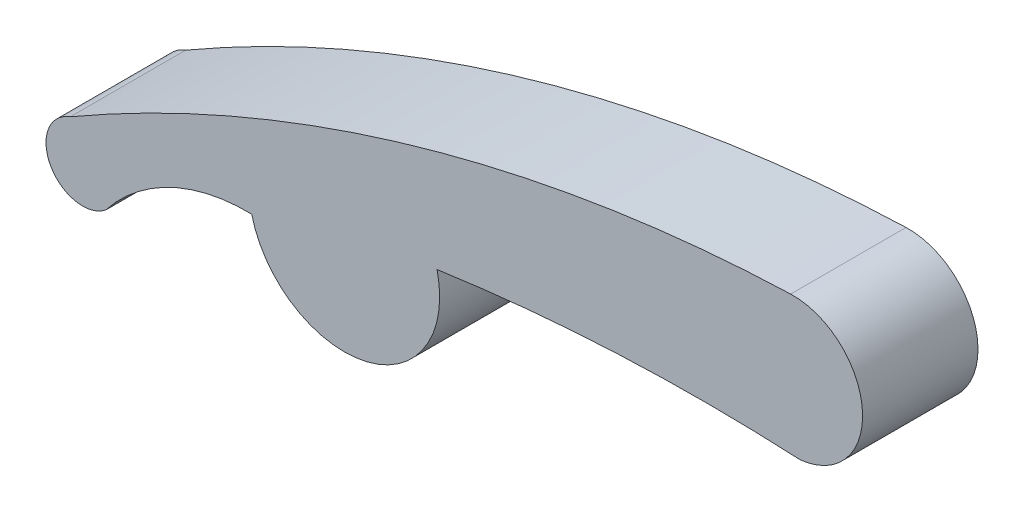
ISO-10303-21;
HEADER;
FILE_DESCRIPTION(('STEP AP214'),'2;1');
FILE_NAME('part.step','',(''),(''),'','','');
FILE_SCHEMA(('AUTOMOTIVE_DESIGN { 1 0 10303 214 1 1 1 1 }'));
ENDSEC;
DATA;
#1=APPLICATION_CONTEXT('core data for automotive mechanical design processes');
#2=APPLICATION_PROTOCOL_DEFINITION('international standard','automotive_design',2000,#1);
#3=PRODUCT_CONTEXT('',#1,'mechanical');
#4=PRODUCT('Part','Part','',(#3));
#5=PRODUCT_RELATED_PRODUCT_CATEGORY('part','',(#4));
#6=PRODUCT_DEFINITION_FORMATION('','',#4);
#7=PRODUCT_DEFINITION_CONTEXT('part definition',#1,'design');
#8=PRODUCT_DEFINITION('design','',#6,#7);
#9=PRODUCT_DEFINITION_SHAPE('','',#8);
#10=(LENGTH_UNIT() NAMED_UNIT(*) SI_UNIT(.MILLI.,.METRE.));
#11=(NAMED_UNIT(*) PLANE_ANGLE_UNIT() SI_UNIT($,.RADIAN.));
#12=(NAMED_UNIT(*) SI_UNIT($,.STERADIAN.) SOLID_ANGLE_UNIT());
#13=UNCERTAINTY_MEASURE_WITH_UNIT(LENGTH_MEASURE(1.E-05),#10,'distance_accuracy_value','');
#14=(GEOMETRIC_REPRESENTATION_CONTEXT(3) GLOBAL_UNCERTAINTY_ASSIGNED_CONTEXT((#13)) GLOBAL_UNIT_ASSIGNED_CONTEXT((#10,
#11,#12)) REPRESENTATION_CONTEXT('',''));
#15=CARTESIAN_POINT('',(0.,0.,0.));
#16=DIRECTION('',(0.,0.,1.));
#17=DIRECTION('',(1.,0.,0.));
#18=AXIS2_PLACEMENT_3D('',#15,#16,#17);
#19=CARTESIAN_POINT('',(0.,0.,30.));
#20=DIRECTION('',(0.,0.,-1.));
#21=DIRECTION('',(-1.,0.,0.));
#22=AXIS2_PLACEMENT_3D('',#19,#20,#21);
#23=CYLINDRICAL_SURFACE('',#22,24.7797364159116);
#24=CARTESIAN_POINT('',(0.,0.,0.));
#25=DIRECTION('',(0.,0.,1.));
#26=DIRECTION('',(1.,0.,0.));
#27=AXIS2_PLACEMENT_3D('',#24,#25,#26);
#28=CIRCLE('',#27,24.7797364159116);
#29=CARTESIAN_POINT('',(-24.087895886264,-5.81451705772353,0.));
#30=VERTEX_POINT('',#29);
#31=CARTESIAN_POINT('',(24.0868229632758,5.81896007701233,0.));
#32=VERTEX_POINT('',#31);
#33=EDGE_CURVE('E125',#30,#32,#28,.T.);
#34=ORIENTED_EDGE('',*,*,#33,.T.);
#35=DIRECTION('',(0.,0.,-1.));
#36=VECTOR('',#35,1.);
#37=CARTESIAN_POINT('',(24.0868229632758,5.81896007701233,30.));
#38=LINE('',#37,#36);
#39=CARTESIAN_POINT('',(24.0868229632758,5.81896007701233,30.));
#40=VERTEX_POINT('',#39);
#41=EDGE_CURVE('E11',#40,#32,#38,.T.);
#42=ORIENTED_EDGE('',*,*,#41,.F.);
#43=CARTESIAN_POINT('',(0.,0.,30.));
#44=DIRECTION('',(0.,0.,1.));
#45=DIRECTION('',(1.,0.,0.));
#46=AXIS2_PLACEMENT_3D('',#43,#44,#45);
#47=CIRCLE('',#46,24.7797364159116);
#48=CARTESIAN_POINT('',(-24.087895886264,-5.81451705772353,30.));
#49=VERTEX_POINT('',#48);
#50=EDGE_CURVE('E135',#49,#40,#47,.T.);
#51=ORIENTED_EDGE('',*,*,#50,.F.);
#52=DIRECTION('',(0.,0.,-1.));
#53=VECTOR('',#52,1.);
#54=CARTESIAN_POINT('',(-24.087895886264,-5.81451705772353,30.));
#55=LINE('',#54,#53);
#56=EDGE_CURVE('E121',#49,#30,#55,.T.);
#57=ORIENTED_EDGE('',*,*,#56,.T.);
#58=EDGE_LOOP('',(#34,#42,#51,#57));
#59=FACE_BOUND('',#58,.T.);
#60=ADVANCED_FACE('F41',(#59),#23,.T.);
#61=CARTESIAN_POINT('',(93.5548495195561,-474.035247811777,30.));
#62=DIRECTION('',(0.,0.,-1.));
#63=DIRECTION('',(-1.,0.,0.));
#64=AXIS2_PLACEMENT_3D('',#61,#62,#63);
#65=CYLINDRICAL_SURFACE('',#64,484.856543260171);
#66=CARTESIAN_POINT('',(93.5548495195561,-474.035247811777,0.));
#67=DIRECTION('',(0.,0.,-1.));
#68=DIRECTION('',(-1.,0.,0.));
#69=AXIS2_PLACEMENT_3D('',#66,#67,#68);
#70=CIRCLE('',#69,484.856543260171);
#71=CARTESIAN_POINT('',(118.482977132816,10.1800514053156,0.));
#72=VERTEX_POINT('',#71);
#73=EDGE_CURVE('E128',#32,#72,#70,.T.);
#74=ORIENTED_EDGE('',*,*,#73,.T.);
#75=DIRECTION('',(0.,0.,-1.));
#76=VECTOR('',#75,1.);
#77=CARTESIAN_POINT('',(118.482977132816,10.1800514053156,30.));
#78=LINE('',#77,#76);
#79=CARTESIAN_POINT('',(118.482977132816,10.1800514053156,30.));
#80=VERTEX_POINT('',#79);
#81=EDGE_CURVE('E49',#80,#72,#78,.T.);
#82=ORIENTED_EDGE('',*,*,#81,.F.);
#83=CARTESIAN_POINT('',(93.5548495195561,-474.035247811777,30.));
#84=DIRECTION('',(0.,0.,-1.));
#85=DIRECTION('',(-1.,0.,0.));
#86=AXIS2_PLACEMENT_3D('',#83,#84,#85);
#87=CIRCLE('',#86,484.856543260171);
#88=EDGE_CURVE('E94',#40,#80,#87,.T.);
#89=ORIENTED_EDGE('',*,*,#88,.F.);
#90=ORIENTED_EDGE('',*,*,#41,.T.);
#91=EDGE_LOOP('',(#74,#82,#89,#90));
#92=FACE_BOUND('',#91,.T.);
#93=ADVANCED_FACE('F159',(#92),#65,.F.);
#94=CARTESIAN_POINT('',(116.644451219308,28.1792831659425,30.));
#95=DIRECTION('',(0.,0.,-1.));
#96=DIRECTION('',(-1.,0.,0.));
#97=AXIS2_PLACEMENT_3D('',#94,#95,#96);
#98=CYLINDRICAL_SURFACE('',#97,18.0928859363949);
#99=CARTESIAN_POINT('',(116.644451219308,28.1792831659425,0.));
#100=DIRECTION('',(0.,0.,1.));
#101=DIRECTION('',(-1.,0.,0.));
#102=AXIS2_PLACEMENT_3D('',#99,#100,#101);
#103=CIRCLE('',#102,18.0928859363949);
#104=CARTESIAN_POINT('',(116.030457788729,46.2617479751051,0.));
#105=VERTEX_POINT('',#104);
#106=EDGE_CURVE('E130',#72,#105,#103,.T.);
#107=ORIENTED_EDGE('',*,*,#106,.T.);
#108=DIRECTION('',(0.,0.,-1.));
#109=VECTOR('',#108,1.);
#110=CARTESIAN_POINT('',(116.030457788729,46.2617479751051,30.));
#111=LINE('',#110,#109);
#112=CARTESIAN_POINT('',(116.030457788729,46.2617479751051,30.));
#113=VERTEX_POINT('',#112);
#114=EDGE_CURVE('E116',#113,#105,#111,.T.);
#115=ORIENTED_EDGE('',*,*,#114,.F.);
#116=CARTESIAN_POINT('',(116.644451219308,28.1792831659425,30.));
#117=DIRECTION('',(0.,0.,1.));
#118=DIRECTION('',(-1.,0.,0.));
#119=AXIS2_PLACEMENT_3D('',#116,#117,#118);
#120=CIRCLE('',#119,18.0928859363949);
#121=EDGE_CURVE('E107',#80,#113,#120,.T.);
#122=ORIENTED_EDGE('',*,*,#121,.F.);
#123=ORIENTED_EDGE('',*,*,#81,.T.);
#124=EDGE_LOOP('',(#107,#115,#122,#123));
#125=FACE_BOUND('',#124,.T.);
#126=ADVANCED_FACE('F141',(#125),#98,.T.);
#127=CARTESIAN_POINT('',(129.639658120415,-354.537143058833,30.));
#128=DIRECTION('',(0.,0.,-1.));
#129=DIRECTION('',(-1.,0.,0.));
#130=AXIS2_PLACEMENT_3D('',#127,#128,#129);
#131=CYLINDRICAL_SURFACE('',#130,401.029875929092);
#132=CARTESIAN_POINT('',(129.639658120415,-354.537143058833,0.));
#133=DIRECTION('',(0.,0.,1.));
#134=DIRECTION('',(-1.,0.,0.));
#135=AXIS2_PLACEMENT_3D('',#132,#133,#134);
#136=CIRCLE('',#135,401.029875929092);
#137=CARTESIAN_POINT('',(-71.2994286744356,-7.48031084578749,0.));
#138=VERTEX_POINT('',#137);
#139=EDGE_CURVE('E115',#105,#138,#136,.T.);
#140=ORIENTED_EDGE('',*,*,#139,.T.);
#141=DIRECTION('',(0.,0.,-1.));
#142=VECTOR('',#141,1.);
#143=CARTESIAN_POINT('',(-71.2994286744356,-7.48031084578749,30.));
#144=LINE('',#143,#142);
#145=CARTESIAN_POINT('',(-71.2994286744356,-7.48031084578749,30.));
#146=VERTEX_POINT('',#145);
#147=EDGE_CURVE('E112',#146,#138,#144,.T.);
#148=ORIENTED_EDGE('',*,*,#147,.F.);
#149=CARTESIAN_POINT('',(129.639658120415,-354.537143058833,30.));
#150=DIRECTION('',(0.,0.,1.));
#151=DIRECTION('',(-1.,0.,0.));
#152=AXIS2_PLACEMENT_3D('',#149,#150,#151);
#153=CIRCLE('',#152,401.029875929092);
#154=EDGE_CURVE('E101',#113,#146,#153,.T.);
#155=ORIENTED_EDGE('',*,*,#154,.F.);
#156=ORIENTED_EDGE('',*,*,#114,.T.);
#157=EDGE_LOOP('',(#140,#148,#155,#156));
#158=FACE_BOUND('',#157,.T.);
#159=ADVANCED_FACE('F113',(#158),#131,.T.);
#160=CARTESIAN_POINT('',(-68.0425965445967,-16.4379151801327,30.));
#161=DIRECTION('',(0.,0.,-1.));
#162=DIRECTION('',(-1.,0.,0.));
#163=AXIS2_PLACEMENT_3D('',#160,#161,#162);
#164=CYLINDRICAL_SURFACE('',#163,9.53129744224947);
#165=CARTESIAN_POINT('',(-68.0425965445967,-16.4379151801327,0.));
#166=DIRECTION('',(0.,0.,1.));
#167=DIRECTION('',(1.,0.,0.));
#168=AXIS2_PLACEMENT_3D('',#165,#166,#167);
#169=CIRCLE('',#168,9.53129744224947);
#170=CARTESIAN_POINT('',(-61.9924777839588,-23.8028112360733,0.));
#171=VERTEX_POINT('',#170);
#172=EDGE_CURVE('E80',#138,#171,#169,.T.);
#173=ORIENTED_EDGE('',*,*,#172,.T.);
#174=DIRECTION('',(0.,0.,-1.));
#175=VECTOR('',#174,1.);
#176=CARTESIAN_POINT('',(-61.9924777839588,-23.8028112360733,30.));
#177=LINE('',#176,#175);
#178=CARTESIAN_POINT('',(-61.9924777839588,-23.8028112360733,30.));
#179=VERTEX_POINT('',#178);
#180=EDGE_CURVE('E117',#179,#171,#177,.T.);
#181=ORIENTED_EDGE('',*,*,#180,.F.);
#182=CARTESIAN_POINT('',(-68.0425965445967,-16.4379151801327,30.));
#183=DIRECTION('',(0.,0.,1.));
#184=DIRECTION('',(1.,0.,0.));
#185=AXIS2_PLACEMENT_3D('',#182,#183,#184);
#186=CIRCLE('',#185,9.53129744224947);
#187=EDGE_CURVE('E105',#146,#179,#186,.T.);
#188=ORIENTED_EDGE('',*,*,#187,.F.);
#189=ORIENTED_EDGE('',*,*,#147,.T.);
#190=EDGE_LOOP('',(#173,#181,#188,#189));
#191=FACE_BOUND('',#190,.T.);
#192=ADVANCED_FACE('F119',(#191),#164,.T.);
#193=CARTESIAN_POINT('',(-25.1623080904096,-52.4805808009641,30.));
#194=DIRECTION('',(0.,0.,-1.));
#195=DIRECTION('',(-1.,0.,0.));
#196=AXIS2_PLACEMENT_3D('',#193,#194,#195);
#197=CYLINDRICAL_SURFACE('',#196,46.6784304242614);
#198=CARTESIAN_POINT('',(-25.1623080904096,-52.4805808009641,0.));
#199=DIRECTION('',(0.,0.,-1.));
#200=DIRECTION('',(-1.,0.,0.));
#201=AXIS2_PLACEMENT_3D('',#198,#199,#200);
#202=CIRCLE('',#201,46.6784304242614);
#203=EDGE_CURVE('E86',#171,#30,#202,.T.);
#204=ORIENTED_EDGE('',*,*,#203,.T.);
#205=ORIENTED_EDGE('',*,*,#56,.F.);
#206=CARTESIAN_POINT('',(-25.1623080904096,-52.4805808009641,30.));
#207=DIRECTION('',(0.,0.,-1.));
#208=DIRECTION('',(-1.,0.,0.));
#209=AXIS2_PLACEMENT_3D('',#206,#207,#208);
#210=CIRCLE('',#209,46.6784304242614);
#211=EDGE_CURVE('E57',#179,#49,#210,.T.);
#212=ORIENTED_EDGE('',*,*,#211,.F.);
#213=ORIENTED_EDGE('',*,*,#180,.T.);
#214=EDGE_LOOP('',(#204,#205,#212,#213));
#215=FACE_BOUND('',#214,.T.);
#216=ADVANCED_FACE('F148',(#215),#197,.F.);
#217=CARTESIAN_POINT('',(46.777424759778,-237.017623905889,30.));
#218=DIRECTION('',(0.,0.,1.));
#219=DIRECTION('',(1.,0.,0.));
#220=AXIS2_PLACEMENT_3D('',#217,#218,#219);
#221=PLANE('',#220);
#222=ORIENTED_EDGE('',*,*,#50,.T.);
#223=ORIENTED_EDGE('',*,*,#88,.T.);
#224=ORIENTED_EDGE('',*,*,#121,.T.);
#225=ORIENTED_EDGE('',*,*,#154,.T.);
#226=ORIENTED_EDGE('',*,*,#187,.T.);
#227=ORIENTED_EDGE('',*,*,#211,.T.);
#228=EDGE_LOOP('',(#222,#223,#224,#225,#226,#227));
#229=FACE_BOUND('',#228,.T.);
#230=ADVANCED_FACE('F103',(#229),#221,.T.);
#231=CARTESIAN_POINT('',(46.777424759778,-237.017623905889,0.));
#232=DIRECTION('',(0.,0.,1.));
#233=DIRECTION('',(1.,0.,0.));
#234=AXIS2_PLACEMENT_3D('',#231,#232,#233);
#235=PLANE('',#234);
#236=ORIENTED_EDGE('',*,*,#33,.F.);
#237=ORIENTED_EDGE('',*,*,#203,.F.);
#238=ORIENTED_EDGE('',*,*,#172,.F.);
#239=ORIENTED_EDGE('',*,*,#139,.F.);
#240=ORIENTED_EDGE('',*,*,#106,.F.);
#241=ORIENTED_EDGE('',*,*,#73,.F.);
#242=EDGE_LOOP('',(#236,#237,#238,#239,#240,#241));
#243=FACE_BOUND('',#242,.T.);
#244=ADVANCED_FACE('F144',(#243),#235,.F.);
#245=CLOSED_SHELL('',(#60,#93,#126,#159,#192,#216,#230,#244));
#246=MANIFOLD_SOLID_BREP('B2',#245);
#247=ADVANCED_BREP_SHAPE_REPRESENTATION('',(#18,#246),#14);
#248=SHAPE_DEFINITION_REPRESENTATION(#9,#247);
ENDSEC;
END-ISO-10303-21;
